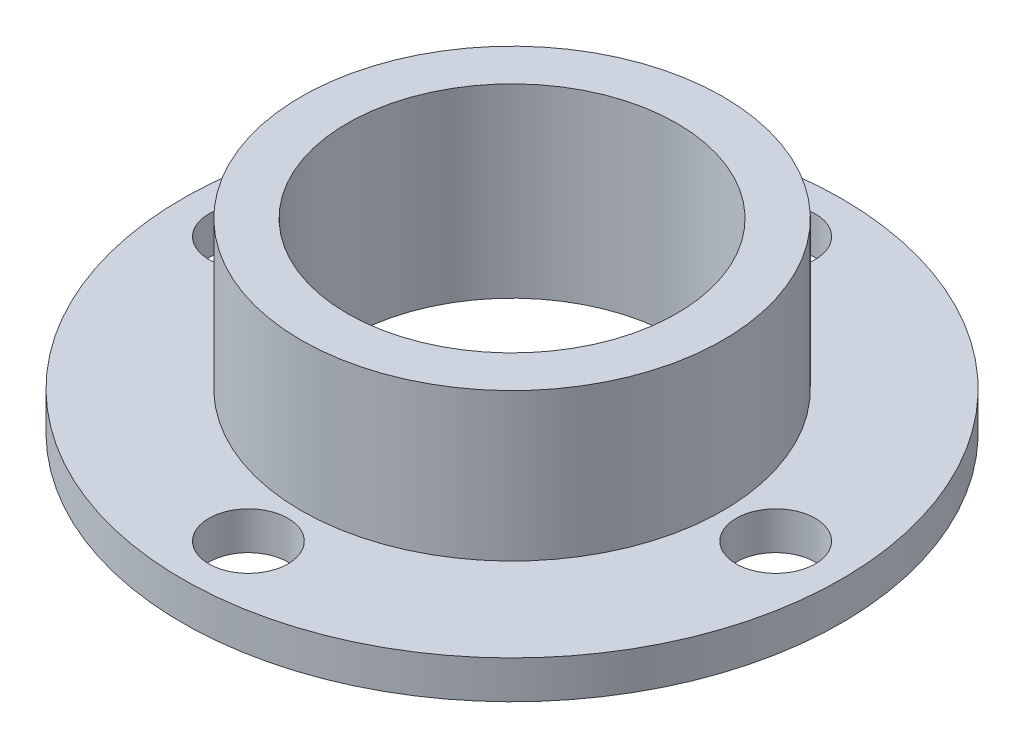
ISO-10303-21;
HEADER;
FILE_DESCRIPTION(('STEP AP214'),'2;1');
FILE_NAME('part.step','',(''),(''),'','','');
FILE_SCHEMA(('AUTOMOTIVE_DESIGN { 1 0 10303 214 1 1 1 1 }'));
ENDSEC;
DATA;
#1=APPLICATION_CONTEXT('core data for automotive mechanical design processes');
#2=APPLICATION_PROTOCOL_DEFINITION('international standard','automotive_design',2000,#1);
#3=PRODUCT_CONTEXT('',#1,'mechanical');
#4=PRODUCT('Part','Part','',(#3));
#5=PRODUCT_RELATED_PRODUCT_CATEGORY('part','',(#4));
#6=PRODUCT_DEFINITION_FORMATION('','',#4);
#7=PRODUCT_DEFINITION_CONTEXT('part definition',#1,'design');
#8=PRODUCT_DEFINITION('design','',#6,#7);
#9=PRODUCT_DEFINITION_SHAPE('','',#8);
#10=(LENGTH_UNIT() NAMED_UNIT(*) SI_UNIT(.MILLI.,.METRE.));
#11=(NAMED_UNIT(*) PLANE_ANGLE_UNIT() SI_UNIT($,.RADIAN.));
#12=(NAMED_UNIT(*) SI_UNIT($,.STERADIAN.) SOLID_ANGLE_UNIT());
#13=UNCERTAINTY_MEASURE_WITH_UNIT(LENGTH_MEASURE(1.E-05),#10,'distance_accuracy_value','');
#14=(GEOMETRIC_REPRESENTATION_CONTEXT(3) GLOBAL_UNCERTAINTY_ASSIGNED_CONTEXT((#13)) GLOBAL_UNIT_ASSIGNED_CONTEXT((#10,
#11,#12)) REPRESENTATION_CONTEXT('',''));
#15=CARTESIAN_POINT('',(0.,0.,0.));
#16=DIRECTION('',(0.,0.,1.));
#17=DIRECTION('',(1.,0.,0.));
#18=AXIS2_PLACEMENT_3D('',#15,#16,#17);
#19=CARTESIAN_POINT('',(0.,1.44,0.));
#20=DIRECTION('',(0.,1.,0.));
#21=DIRECTION('',(0.,0.,1.));
#22=AXIS2_PLACEMENT_3D('',#19,#20,#21);
#23=PLANE('',#22);
#24=CARTESIAN_POINT('',(0.,1.44,0.));
#25=DIRECTION('',(0.,1.,0.));
#26=DIRECTION('',(0.,0.,1.));
#27=AXIS2_PLACEMENT_3D('',#24,#25,#26);
#28=CIRCLE('',#27,8.);
#29=CARTESIAN_POINT('',(0.,1.44,8.));
#30=VERTEX_POINT('',#29);
#31=EDGE_CURVE('E10',#30,#30,#28,.T.);
#32=ORIENTED_EDGE('',*,*,#31,.F.);
#33=EDGE_LOOP('',(#32));
#34=FACE_BOUND('',#33,.T.);
#35=CARTESIAN_POINT('',(0.,1.44,10.));
#36=DIRECTION('',(0.,1.,0.));
#37=DIRECTION('',(0.,0.,1.));
#38=AXIS2_PLACEMENT_3D('',#35,#36,#37);
#39=CIRCLE('',#38,1.5);
#40=CARTESIAN_POINT('',(0.,1.44,8.5));
#41=VERTEX_POINT('',#40);
#42=EDGE_CURVE('E72',#41,#41,#39,.T.);
#43=ORIENTED_EDGE('',*,*,#42,.F.);
#44=EDGE_LOOP('',(#43));
#45=FACE_BOUND('',#44,.T.);
#46=CARTESIAN_POINT('',(0.,1.44,-10.));
#47=DIRECTION('',(0.,1.,0.));
#48=DIRECTION('',(0.,0.,1.));
#49=AXIS2_PLACEMENT_3D('',#46,#47,#48);
#50=CIRCLE('',#49,1.5);
#51=CARTESIAN_POINT('',(0.,1.44,-11.5));
#52=VERTEX_POINT('',#51);
#53=EDGE_CURVE('E88',#52,#52,#50,.T.);
#54=ORIENTED_EDGE('',*,*,#53,.F.);
#55=EDGE_LOOP('',(#54));
#56=FACE_BOUND('',#55,.T.);
#57=CARTESIAN_POINT('',(0.,1.44,0.));
#58=DIRECTION('',(0.,1.,0.));
#59=DIRECTION('',(0.,0.,1.));
#60=AXIS2_PLACEMENT_3D('',#57,#58,#59);
#61=CIRCLE('',#60,12.5);
#62=CARTESIAN_POINT('',(0.,1.44,-12.5));
#63=VERTEX_POINT('',#62);
#64=EDGE_CURVE('E52',#63,#63,#61,.T.);
#65=ORIENTED_EDGE('',*,*,#64,.T.);
#66=EDGE_LOOP('',(#65));
#67=FACE_BOUND('',#66,.T.);
#68=CARTESIAN_POINT('',(10.,1.44,0.));
#69=DIRECTION('',(0.,1.,0.));
#70=DIRECTION('',(0.,0.,1.));
#71=AXIS2_PLACEMENT_3D('',#68,#69,#70);
#72=CIRCLE('',#71,1.5);
#73=CARTESIAN_POINT('',(10.,1.44,-1.49999999999996));
#74=VERTEX_POINT('',#73);
#75=EDGE_CURVE('E80',#74,#74,#72,.T.);
#76=ORIENTED_EDGE('',*,*,#75,.F.);
#77=EDGE_LOOP('',(#76));
#78=FACE_BOUND('',#77,.T.);
#79=CARTESIAN_POINT('',(-10.,1.44,-1.04744440165294E-13));
#80=DIRECTION('',(0.,1.,0.));
#81=DIRECTION('',(0.,0.,1.));
#82=AXIS2_PLACEMENT_3D('',#79,#80,#81);
#83=CIRCLE('',#82,1.5);
#84=CARTESIAN_POINT('',(-10.,1.44,-1.5000000000001));
#85=VERTEX_POINT('',#84);
#86=EDGE_CURVE('E63',#85,#85,#83,.T.);
#87=ORIENTED_EDGE('',*,*,#86,.F.);
#88=EDGE_LOOP('',(#87));
#89=FACE_BOUND('',#88,.T.);
#90=ADVANCED_FACE('F43',(#34,#45,#56,#67,#78,#89),#23,.T.);
#91=CARTESIAN_POINT('',(0.,0.,0.));
#92=DIRECTION('',(0.,1.,0.));
#93=DIRECTION('',(0.,0.,1.));
#94=AXIS2_PLACEMENT_3D('',#91,#92,#93);
#95=PLANE('',#94);
#96=CARTESIAN_POINT('',(0.,0.,0.));
#97=DIRECTION('',(0.,1.,0.));
#98=DIRECTION('',(0.,0.,1.));
#99=AXIS2_PLACEMENT_3D('',#96,#97,#98);
#100=CIRCLE('',#99,12.5);
#101=CARTESIAN_POINT('',(0.,0.,-12.5));
#102=VERTEX_POINT('',#101);
#103=EDGE_CURVE('E47',#102,#102,#100,.T.);
#104=ORIENTED_EDGE('',*,*,#103,.F.);
#105=EDGE_LOOP('',(#104));
#106=FACE_BOUND('',#105,.T.);
#107=CARTESIAN_POINT('',(0.,0.,0.));
#108=DIRECTION('',(0.,1.,0.));
#109=DIRECTION('',(0.,0.,1.));
#110=AXIS2_PLACEMENT_3D('',#107,#108,#109);
#111=CIRCLE('',#110,6.25);
#112=CARTESIAN_POINT('',(0.,0.,-6.25));
#113=VERTEX_POINT('',#112);
#114=EDGE_CURVE('E91',#113,#113,#111,.T.);
#115=ORIENTED_EDGE('',*,*,#114,.T.);
#116=EDGE_LOOP('',(#115));
#117=FACE_BOUND('',#116,.T.);
#118=CARTESIAN_POINT('',(0.,0.,-10.));
#119=DIRECTION('',(0.,1.,0.));
#120=DIRECTION('',(0.,0.,1.));
#121=AXIS2_PLACEMENT_3D('',#118,#119,#120);
#122=CIRCLE('',#121,1.5);
#123=CARTESIAN_POINT('',(0.,0.,-11.5));
#124=VERTEX_POINT('',#123);
#125=EDGE_CURVE('E84',#124,#124,#122,.T.);
#126=ORIENTED_EDGE('',*,*,#125,.T.);
#127=EDGE_LOOP('',(#126));
#128=FACE_BOUND('',#127,.T.);
#129=CARTESIAN_POINT('',(10.,0.,0.));
#130=DIRECTION('',(0.,1.,0.));
#131=DIRECTION('',(0.,0.,1.));
#132=AXIS2_PLACEMENT_3D('',#129,#130,#131);
#133=CIRCLE('',#132,1.5);
#134=CARTESIAN_POINT('',(10.,0.,-1.49999999999996));
#135=VERTEX_POINT('',#134);
#136=EDGE_CURVE('E76',#135,#135,#133,.T.);
#137=ORIENTED_EDGE('',*,*,#136,.T.);
#138=EDGE_LOOP('',(#137));
#139=FACE_BOUND('',#138,.T.);
#140=CARTESIAN_POINT('',(0.,0.,10.));
#141=DIRECTION('',(0.,1.,0.));
#142=DIRECTION('',(0.,0.,1.));
#143=AXIS2_PLACEMENT_3D('',#140,#141,#142);
#144=CIRCLE('',#143,1.5);
#145=CARTESIAN_POINT('',(0.,0.,8.5));
#146=VERTEX_POINT('',#145);
#147=EDGE_CURVE('E67',#146,#146,#144,.T.);
#148=ORIENTED_EDGE('',*,*,#147,.T.);
#149=EDGE_LOOP('',(#148));
#150=FACE_BOUND('',#149,.T.);
#151=CARTESIAN_POINT('',(-10.,0.,-1.04744440165294E-13));
#152=DIRECTION('',(0.,1.,0.));
#153=DIRECTION('',(0.,0.,1.));
#154=AXIS2_PLACEMENT_3D('',#151,#152,#153);
#155=CIRCLE('',#154,1.5);
#156=CARTESIAN_POINT('',(-10.,0.,-1.5000000000001));
#157=VERTEX_POINT('',#156);
#158=EDGE_CURVE('E68',#157,#157,#155,.T.);
#159=ORIENTED_EDGE('',*,*,#158,.T.);
#160=EDGE_LOOP('',(#159));
#161=FACE_BOUND('',#160,.T.);
#162=ADVANCED_FACE('F104',(#106,#117,#128,#139,#150,#161),#95,.F.);
#163=CARTESIAN_POINT('',(0.,1.44,0.));
#164=DIRECTION('',(0.,-1.,0.));
#165=DIRECTION('',(0.,0.,-1.));
#166=AXIS2_PLACEMENT_3D('',#163,#164,#165);
#167=CYLINDRICAL_SURFACE('',#166,12.5);
#168=CARTESIAN_POINT('',(0.,1.44,-12.5));
#169=CARTESIAN_POINT('',(0.,1.425,-12.5));
#170=CARTESIAN_POINT('',(0.,1.41,-12.5));
#171=CARTESIAN_POINT('',(0.,1.38,-12.5));
#172=CARTESIAN_POINT('',(0.,1.365,-12.5));
#173=CARTESIAN_POINT('',(0.,1.335,-12.5));
#174=CARTESIAN_POINT('',(0.,1.32,-12.5));
#175=CARTESIAN_POINT('',(0.,1.29,-12.5));
#176=CARTESIAN_POINT('',(0.,1.275,-12.5));
#177=CARTESIAN_POINT('',(0.,1.245,-12.5));
#178=CARTESIAN_POINT('',(0.,1.23,-12.5));
#179=CARTESIAN_POINT('',(0.,1.2,-12.5));
#180=CARTESIAN_POINT('',(0.,1.185,-12.5));
#181=CARTESIAN_POINT('',(0.,1.155,-12.5));
#182=CARTESIAN_POINT('',(0.,1.14,-12.5));
#183=CARTESIAN_POINT('',(0.,1.11,-12.5));
#184=CARTESIAN_POINT('',(0.,1.095,-12.5));
#185=CARTESIAN_POINT('',(0.,1.065,-12.5));
#186=CARTESIAN_POINT('',(0.,1.05,-12.5));
#187=CARTESIAN_POINT('',(0.,1.02,-12.5));
#188=CARTESIAN_POINT('',(0.,1.005,-12.5));
#189=CARTESIAN_POINT('',(0.,0.975,-12.5));
#190=CARTESIAN_POINT('',(0.,0.96,-12.5));
#191=CARTESIAN_POINT('',(0.,0.93,-12.5));
#192=CARTESIAN_POINT('',(0.,0.915,-12.5));
#193=CARTESIAN_POINT('',(0.,0.885,-12.5));
#194=CARTESIAN_POINT('',(0.,0.87,-12.5));
#195=CARTESIAN_POINT('',(0.,0.84,-12.5));
#196=CARTESIAN_POINT('',(0.,0.825,-12.5));
#197=CARTESIAN_POINT('',(0.,0.795,-12.5));
#198=CARTESIAN_POINT('',(0.,0.78,-12.5));
#199=CARTESIAN_POINT('',(0.,0.75,-12.5));
#200=CARTESIAN_POINT('',(0.,0.735,-12.5));
#201=CARTESIAN_POINT('',(0.,0.705,-12.5));
#202=CARTESIAN_POINT('',(0.,0.69,-12.5));
#203=CARTESIAN_POINT('',(0.,0.66,-12.5));
#204=CARTESIAN_POINT('',(0.,0.645,-12.5));
#205=CARTESIAN_POINT('',(0.,0.615,-12.5));
#206=CARTESIAN_POINT('',(0.,0.6,-12.5));
#207=CARTESIAN_POINT('',(0.,0.57,-12.5));
#208=CARTESIAN_POINT('',(0.,0.555,-12.5));
#209=CARTESIAN_POINT('',(0.,0.525,-12.5));
#210=CARTESIAN_POINT('',(0.,0.51,-12.5));
#211=CARTESIAN_POINT('',(0.,0.48,-12.5));
#212=CARTESIAN_POINT('',(0.,0.465,-12.5));
#213=CARTESIAN_POINT('',(0.,0.435,-12.5));
#214=CARTESIAN_POINT('',(0.,0.42,-12.5));
#215=CARTESIAN_POINT('',(0.,0.39,-12.5));
#216=CARTESIAN_POINT('',(0.,0.375,-12.5));
#217=CARTESIAN_POINT('',(0.,0.345,-12.5));
#218=CARTESIAN_POINT('',(0.,0.33,-12.5));
#219=CARTESIAN_POINT('',(0.,0.3,-12.5));
#220=CARTESIAN_POINT('',(0.,0.285,-12.5));
#221=CARTESIAN_POINT('',(0.,0.255,-12.5));
#222=CARTESIAN_POINT('',(0.,0.24,-12.5));
#223=CARTESIAN_POINT('',(0.,0.21,-12.5));
#224=CARTESIAN_POINT('',(0.,0.195,-12.5));
#225=CARTESIAN_POINT('',(0.,0.165,-12.5));
#226=CARTESIAN_POINT('',(0.,0.15,-12.5));
#227=CARTESIAN_POINT('',(0.,0.12,-12.5));
#228=CARTESIAN_POINT('',(0.,0.105,-12.5));
#229=CARTESIAN_POINT('',(0.,0.0749999999999998,-12.5));
#230=CARTESIAN_POINT('',(0.,0.0599999999999997,-12.5));
#231=CARTESIAN_POINT('',(0.,0.0299999999999997,-12.5));
#232=CARTESIAN_POINT('',(0.,0.0149999999999998,-12.5));
#233=CARTESIAN_POINT('',(0.,0.,-12.5));
#234=B_SPLINE_CURVE_WITH_KNOTS('',3,(#168,#169,#170,#171,#172,#173,#174,#175,#176,#177,#178,
#179,#180,#181,#182,#183,#184,#185,#186,#187,#188,#189,#190,#191,#192,#193,#194,#195,#196,#197,
#198,#199,#200,#201,#202,#203,#204,#205,#206,#207,#208,#209,#210,#211,#212,#213,#214,#215,#216,
#217,#218,#219,#220,#221,#222,#223,#224,#225,#226,#227,#228,#229,#230,#231,#232,#233),
.UNSPECIFIED.,.F.,.F.,(4,2,2,2,2,2,2,2,2,2,2,2,2,2,2,2,2,2,2,2,2,2,2,2,2,2,2,2,2,2,2,2,4),(0.,
0.0450000000000001,0.09,0.135,0.18,0.225,0.27,0.315,0.36,0.405,0.45,0.495,0.54,0.585,0.63,0.675,
0.72,0.765,0.81,0.855,0.9,0.945,0.99,1.035,1.08,1.125,1.17,1.215,1.26,1.305,1.35,1.395,1.44),.UNSPECIFIED.);
#235=EDGE_CURVE('BSEAM45',#63,#102,#234,.T.);
#236=ORIENTED_EDGE('',*,*,#64,.F.);
#237=ORIENTED_EDGE('',*,*,#103,.T.);
#238=ORIENTED_EDGE('',*,*,#235,.T.);
#239=ORIENTED_EDGE('',*,*,#235,.F.);
#240=EDGE_LOOP('',(#236,#238,#237,#239));
#241=FACE_BOUND('',#240,.T.);
#242=ADVANCED_FACE('F45',(#241),#167,.T.);
#243=CARTESIAN_POINT('',(0.,1.44,0.));
#244=DIRECTION('',(0.,-1.,0.));
#245=DIRECTION('',(0.,0.,-1.));
#246=AXIS2_PLACEMENT_3D('',#243,#244,#245);
#247=CYLINDRICAL_SURFACE('',#246,6.25);
#248=CARTESIAN_POINT('',(0.,7.04,0.));
#249=DIRECTION('',(0.,1.,0.));
#250=DIRECTION('',(0.,0.,1.));
#251=AXIS2_PLACEMENT_3D('',#248,#249,#250);
#252=CIRCLE('',#251,6.25);
#253=CARTESIAN_POINT('',(0.,7.04,-6.25));
#254=VERTEX_POINT('',#253);
#255=EDGE_CURVE('E252',#254,#254,#252,.T.);
#256=CARTESIAN_POINT('',(0.,0.,-6.25));
#257=CARTESIAN_POINT('',(0.,0.0733333333333332,-6.25));
#258=CARTESIAN_POINT('',(0.,0.146666666666666,-6.25));
#259=CARTESIAN_POINT('',(0.,0.293333333333333,-6.25));
#260=CARTESIAN_POINT('',(0.,0.366666666666666,-6.25));
#261=CARTESIAN_POINT('',(0.,0.513333333333333,-6.25));
#262=CARTESIAN_POINT('',(0.,0.586666666666666,-6.25));
#263=CARTESIAN_POINT('',(0.,0.733333333333333,-6.25));
#264=CARTESIAN_POINT('',(0.,0.806666666666666,-6.25));
#265=CARTESIAN_POINT('',(0.,0.953333333333333,-6.25));
#266=CARTESIAN_POINT('',(0.,1.02666666666667,-6.25));
#267=CARTESIAN_POINT('',(0.,1.17333333333333,-6.25));
#268=CARTESIAN_POINT('',(0.,1.24666666666667,-6.25));
#269=CARTESIAN_POINT('',(0.,1.39333333333333,-6.25));
#270=CARTESIAN_POINT('',(0.,1.46666666666667,-6.25));
#271=CARTESIAN_POINT('',(0.,1.61333333333333,-6.25));
#272=CARTESIAN_POINT('',(0.,1.68666666666667,-6.25));
#273=CARTESIAN_POINT('',(0.,1.83333333333333,-6.25));
#274=CARTESIAN_POINT('',(0.,1.90666666666667,-6.25));
#275=CARTESIAN_POINT('',(0.,2.05333333333333,-6.25));
#276=CARTESIAN_POINT('',(0.,2.12666666666667,-6.25));
#277=CARTESIAN_POINT('',(0.,2.27333333333333,-6.25));
#278=CARTESIAN_POINT('',(0.,2.34666666666667,-6.25));
#279=CARTESIAN_POINT('',(0.,2.49333333333333,-6.25));
#280=CARTESIAN_POINT('',(0.,2.56666666666667,-6.25));
#281=CARTESIAN_POINT('',(0.,2.71333333333333,-6.25));
#282=CARTESIAN_POINT('',(0.,2.78666666666667,-6.25));
#283=CARTESIAN_POINT('',(0.,2.93333333333333,-6.25));
#284=CARTESIAN_POINT('',(0.,3.00666666666667,-6.25));
#285=CARTESIAN_POINT('',(0.,3.15333333333333,-6.25));
#286=CARTESIAN_POINT('',(0.,3.22666666666667,-6.25));
#287=CARTESIAN_POINT('',(0.,3.37333333333333,-6.25));
#288=CARTESIAN_POINT('',(0.,3.44666666666667,-6.25));
#289=CARTESIAN_POINT('',(0.,3.59333333333333,-6.25));
#290=CARTESIAN_POINT('',(0.,3.66666666666667,-6.25));
#291=CARTESIAN_POINT('',(0.,3.81333333333333,-6.25));
#292=CARTESIAN_POINT('',(0.,3.88666666666667,-6.25));
#293=CARTESIAN_POINT('',(0.,4.03333333333333,-6.25));
#294=CARTESIAN_POINT('',(0.,4.10666666666667,-6.25));
#295=CARTESIAN_POINT('',(0.,4.25333333333333,-6.25));
#296=CARTESIAN_POINT('',(0.,4.32666666666667,-6.25));
#297=CARTESIAN_POINT('',(0.,4.47333333333333,-6.25));
#298=CARTESIAN_POINT('',(0.,4.54666666666667,-6.25));
#299=CARTESIAN_POINT('',(0.,4.69333333333333,-6.25));
#300=CARTESIAN_POINT('',(0.,4.76666666666667,-6.25));
#301=CARTESIAN_POINT('',(0.,4.91333333333333,-6.25));
#302=CARTESIAN_POINT('',(0.,4.98666666666667,-6.25));
#303=CARTESIAN_POINT('',(0.,5.13333333333333,-6.25));
#304=CARTESIAN_POINT('',(0.,5.20666666666667,-6.25));
#305=CARTESIAN_POINT('',(0.,5.35333333333333,-6.25));
#306=CARTESIAN_POINT('',(0.,5.42666666666666,-6.25));
#307=CARTESIAN_POINT('',(0.,5.57333333333333,-6.25));
#308=CARTESIAN_POINT('',(0.,5.64666666666666,-6.25));
#309=CARTESIAN_POINT('',(0.,5.79333333333333,-6.25));
#310=CARTESIAN_POINT('',(0.,5.86666666666666,-6.25));
#311=CARTESIAN_POINT('',(0.,6.01333333333333,-6.25));
#312=CARTESIAN_POINT('',(0.,6.08666666666667,-6.25));
#313=CARTESIAN_POINT('',(0.,6.23333333333333,-6.25));
#314=CARTESIAN_POINT('',(0.,6.30666666666666,-6.25));
#315=CARTESIAN_POINT('',(0.,6.45333333333333,-6.25));
#316=CARTESIAN_POINT('',(0.,6.52666666666666,-6.25));
#317=CARTESIAN_POINT('',(0.,6.67333333333333,-6.25));
#318=CARTESIAN_POINT('',(0.,6.74666666666666,-6.25));
#319=CARTESIAN_POINT('',(0.,6.89333333333333,-6.25));
#320=CARTESIAN_POINT('',(0.,6.96666666666666,-6.25));
#321=CARTESIAN_POINT('',(0.,7.04,-6.25));
#322=B_SPLINE_CURVE_WITH_KNOTS('',3,(#256,#257,#258,#259,#260,#261,#262,#263,#264,#265,#266,
#267,#268,#269,#270,#271,#272,#273,#274,#275,#276,#277,#278,#279,#280,#281,#282,#283,#284,#285,
#286,#287,#288,#289,#290,#291,#292,#293,#294,#295,#296,#297,#298,#299,#300,#301,#302,#303,#304,
#305,#306,#307,#308,#309,#310,#311,#312,#313,#314,#315,#316,#317,#318,#319,#320,#321),
.UNSPECIFIED.,.F.,.F.,(4,2,2,2,2,2,2,2,2,2,2,2,2,2,2,2,2,2,2,2,2,2,2,2,2,2,2,2,2,2,2,2,4),(0.,
0.22,0.44,0.66,0.88,1.1,1.32,1.54,1.76,1.98,2.2,2.42,2.64,2.86,3.08,3.3,3.52,3.74,3.96,4.18,4.4,
4.62,4.84,5.06,5.28,5.5,5.72,5.94,6.16,6.38,6.6,6.82,7.04),.UNSPECIFIED.);
#323=EDGE_CURVE('BSEAM139',#113,#254,#322,.T.);
#324=ORIENTED_EDGE('',*,*,#114,.F.);
#325=ORIENTED_EDGE('',*,*,#255,.T.);
#326=ORIENTED_EDGE('',*,*,#323,.T.);
#327=ORIENTED_EDGE('',*,*,#323,.F.);
#328=EDGE_LOOP('',(#324,#326,#325,#327));
#329=FACE_BOUND('',#328,.T.);
#330=ADVANCED_FACE('F139',(#329),#247,.F.);
#331=CARTESIAN_POINT('',(0.,1.44,-10.));
#332=DIRECTION('',(0.,-1.,0.));
#333=DIRECTION('',(0.,0.,-1.));
#334=AXIS2_PLACEMENT_3D('',#331,#332,#333);
#335=CYLINDRICAL_SURFACE('',#334,1.5);
#336=CARTESIAN_POINT('',(0.,1.44,-11.5));
#337=CARTESIAN_POINT('',(0.,1.425,-11.5));
#338=CARTESIAN_POINT('',(0.,1.41,-11.5));
#339=CARTESIAN_POINT('',(0.,1.38,-11.5));
#340=CARTESIAN_POINT('',(0.,1.365,-11.5));
#341=CARTESIAN_POINT('',(0.,1.335,-11.5));
#342=CARTESIAN_POINT('',(0.,1.32,-11.5));
#343=CARTESIAN_POINT('',(0.,1.29,-11.5));
#344=CARTESIAN_POINT('',(0.,1.275,-11.5));
#345=CARTESIAN_POINT('',(0.,1.245,-11.5));
#346=CARTESIAN_POINT('',(0.,1.23,-11.5));
#347=CARTESIAN_POINT('',(0.,1.2,-11.5));
#348=CARTESIAN_POINT('',(0.,1.185,-11.5));
#349=CARTESIAN_POINT('',(0.,1.155,-11.5));
#350=CARTESIAN_POINT('',(0.,1.14,-11.5));
#351=CARTESIAN_POINT('',(0.,1.11,-11.5));
#352=CARTESIAN_POINT('',(0.,1.095,-11.5));
#353=CARTESIAN_POINT('',(0.,1.065,-11.5));
#354=CARTESIAN_POINT('',(0.,1.05,-11.5));
#355=CARTESIAN_POINT('',(0.,1.02,-11.5));
#356=CARTESIAN_POINT('',(0.,1.005,-11.5));
#357=CARTESIAN_POINT('',(0.,0.975,-11.5));
#358=CARTESIAN_POINT('',(0.,0.96,-11.5));
#359=CARTESIAN_POINT('',(0.,0.93,-11.5));
#360=CARTESIAN_POINT('',(0.,0.915,-11.5));
#361=CARTESIAN_POINT('',(0.,0.885,-11.5));
#362=CARTESIAN_POINT('',(0.,0.87,-11.5));
#363=CARTESIAN_POINT('',(0.,0.84,-11.5));
#364=CARTESIAN_POINT('',(0.,0.825,-11.5));
#365=CARTESIAN_POINT('',(0.,0.795,-11.5));
#366=CARTESIAN_POINT('',(0.,0.78,-11.5));
#367=CARTESIAN_POINT('',(0.,0.75,-11.5));
#368=CARTESIAN_POINT('',(0.,0.735,-11.5));
#369=CARTESIAN_POINT('',(0.,0.705,-11.5));
#370=CARTESIAN_POINT('',(0.,0.69,-11.5));
#371=CARTESIAN_POINT('',(0.,0.66,-11.5));
#372=CARTESIAN_POINT('',(0.,0.645,-11.5));
#373=CARTESIAN_POINT('',(0.,0.615,-11.5));
#374=CARTESIAN_POINT('',(0.,0.6,-11.5));
#375=CARTESIAN_POINT('',(0.,0.57,-11.5));
#376=CARTESIAN_POINT('',(0.,0.555,-11.5));
#377=CARTESIAN_POINT('',(0.,0.525,-11.5));
#378=CARTESIAN_POINT('',(0.,0.51,-11.5));
#379=CARTESIAN_POINT('',(0.,0.48,-11.5));
#380=CARTESIAN_POINT('',(0.,0.465,-11.5));
#381=CARTESIAN_POINT('',(0.,0.435,-11.5));
#382=CARTESIAN_POINT('',(0.,0.42,-11.5));
#383=CARTESIAN_POINT('',(0.,0.39,-11.5));
#384=CARTESIAN_POINT('',(0.,0.375,-11.5));
#385=CARTESIAN_POINT('',(0.,0.345,-11.5));
#386=CARTESIAN_POINT('',(0.,0.33,-11.5));
#387=CARTESIAN_POINT('',(0.,0.3,-11.5));
#388=CARTESIAN_POINT('',(0.,0.285,-11.5));
#389=CARTESIAN_POINT('',(0.,0.255,-11.5));
#390=CARTESIAN_POINT('',(0.,0.24,-11.5));
#391=CARTESIAN_POINT('',(0.,0.21,-11.5));
#392=CARTESIAN_POINT('',(0.,0.195,-11.5));
#393=CARTESIAN_POINT('',(0.,0.165,-11.5));
#394=CARTESIAN_POINT('',(0.,0.15,-11.5));
#395=CARTESIAN_POINT('',(0.,0.12,-11.5));
#396=CARTESIAN_POINT('',(0.,0.105,-11.5));
#397=CARTESIAN_POINT('',(0.,0.0749999999999998,-11.5));
#398=CARTESIAN_POINT('',(0.,0.0599999999999997,-11.5));
#399=CARTESIAN_POINT('',(0.,0.0299999999999997,-11.5));
#400=CARTESIAN_POINT('',(0.,0.0149999999999998,-11.5));
#401=CARTESIAN_POINT('',(0.,0.,-11.5));
#402=B_SPLINE_CURVE_WITH_KNOTS('',3,(#336,#337,#338,#339,#340,#341,#342,#343,#344,#345,#346,
#347,#348,#349,#350,#351,#352,#353,#354,#355,#356,#357,#358,#359,#360,#361,#362,#363,#364,#365,
#366,#367,#368,#369,#370,#371,#372,#373,#374,#375,#376,#377,#378,#379,#380,#381,#382,#383,#384,
#385,#386,#387,#388,#389,#390,#391,#392,#393,#394,#395,#396,#397,#398,#399,#400,#401),
.UNSPECIFIED.,.F.,.F.,(4,2,2,2,2,2,2,2,2,2,2,2,2,2,2,2,2,2,2,2,2,2,2,2,2,2,2,2,2,2,2,2,4),(0.,
0.0450000000000001,0.09,0.135,0.18,0.225,0.27,0.315,0.36,0.405,0.45,0.495,0.54,0.585,0.63,0.675,
0.72,0.765,0.81,0.855,0.9,0.945,0.99,1.035,1.08,1.125,1.17,1.215,1.26,1.305,1.35,1.395,1.44),.UNSPECIFIED.);
#403=EDGE_CURVE('BSEAM142',#52,#124,#402,.T.);
#404=ORIENTED_EDGE('',*,*,#53,.T.);
#405=ORIENTED_EDGE('',*,*,#125,.F.);
#406=ORIENTED_EDGE('',*,*,#403,.T.);
#407=ORIENTED_EDGE('',*,*,#403,.F.);
#408=EDGE_LOOP('',(#404,#406,#405,#407));
#409=FACE_BOUND('',#408,.T.);
#410=ADVANCED_FACE('F142',(#409),#335,.F.);
#411=CARTESIAN_POINT('',(10.,1.44,0.));
#412=DIRECTION('',(0.,-1.,0.));
#413=DIRECTION('',(0.,0.,-1.));
#414=AXIS2_PLACEMENT_3D('',#411,#412,#413);
#415=CYLINDRICAL_SURFACE('',#414,1.5);
#416=CARTESIAN_POINT('',(10.,1.44,-1.49999999999996));
#417=CARTESIAN_POINT('',(10.,1.425,-1.49999999999996));
#418=CARTESIAN_POINT('',(10.,1.41,-1.49999999999996));
#419=CARTESIAN_POINT('',(10.,1.38,-1.49999999999996));
#420=CARTESIAN_POINT('',(10.,1.365,-1.49999999999996));
#421=CARTESIAN_POINT('',(10.,1.335,-1.49999999999996));
#422=CARTESIAN_POINT('',(10.,1.32,-1.49999999999996));
#423=CARTESIAN_POINT('',(10.,1.29,-1.49999999999996));
#424=CARTESIAN_POINT('',(10.,1.275,-1.49999999999996));
#425=CARTESIAN_POINT('',(10.,1.245,-1.49999999999996));
#426=CARTESIAN_POINT('',(10.,1.23,-1.49999999999996));
#427=CARTESIAN_POINT('',(10.,1.2,-1.49999999999996));
#428=CARTESIAN_POINT('',(10.,1.185,-1.49999999999996));
#429=CARTESIAN_POINT('',(10.,1.155,-1.49999999999996));
#430=CARTESIAN_POINT('',(10.,1.14,-1.49999999999996));
#431=CARTESIAN_POINT('',(10.,1.11,-1.49999999999996));
#432=CARTESIAN_POINT('',(10.,1.095,-1.49999999999996));
#433=CARTESIAN_POINT('',(10.,1.065,-1.49999999999996));
#434=CARTESIAN_POINT('',(10.,1.05,-1.49999999999996));
#435=CARTESIAN_POINT('',(10.,1.02,-1.49999999999996));
#436=CARTESIAN_POINT('',(10.,1.005,-1.49999999999996));
#437=CARTESIAN_POINT('',(10.,0.975,-1.49999999999996));
#438=CARTESIAN_POINT('',(10.,0.96,-1.49999999999996));
#439=CARTESIAN_POINT('',(10.,0.93,-1.49999999999996));
#440=CARTESIAN_POINT('',(10.,0.915,-1.49999999999996));
#441=CARTESIAN_POINT('',(10.,0.885,-1.49999999999996));
#442=CARTESIAN_POINT('',(10.,0.87,-1.49999999999996));
#443=CARTESIAN_POINT('',(10.,0.84,-1.49999999999996));
#444=CARTESIAN_POINT('',(10.,0.825,-1.49999999999996));
#445=CARTESIAN_POINT('',(10.,0.795,-1.49999999999996));
#446=CARTESIAN_POINT('',(10.,0.78,-1.49999999999996));
#447=CARTESIAN_POINT('',(10.,0.75,-1.49999999999996));
#448=CARTESIAN_POINT('',(10.,0.735,-1.49999999999996));
#449=CARTESIAN_POINT('',(10.,0.705,-1.49999999999996));
#450=CARTESIAN_POINT('',(10.,0.69,-1.49999999999996));
#451=CARTESIAN_POINT('',(10.,0.66,-1.49999999999996));
#452=CARTESIAN_POINT('',(10.,0.645,-1.49999999999996));
#453=CARTESIAN_POINT('',(10.,0.615,-1.49999999999996));
#454=CARTESIAN_POINT('',(10.,0.6,-1.49999999999996));
#455=CARTESIAN_POINT('',(10.,0.57,-1.49999999999996));
#456=CARTESIAN_POINT('',(10.,0.555,-1.49999999999996));
#457=CARTESIAN_POINT('',(10.,0.525,-1.49999999999996));
#458=CARTESIAN_POINT('',(10.,0.51,-1.49999999999996));
#459=CARTESIAN_POINT('',(10.,0.48,-1.49999999999996));
#460=CARTESIAN_POINT('',(10.,0.465,-1.49999999999996));
#461=CARTESIAN_POINT('',(10.,0.435,-1.49999999999996));
#462=CARTESIAN_POINT('',(10.,0.42,-1.49999999999996));
#463=CARTESIAN_POINT('',(10.,0.39,-1.49999999999996));
#464=CARTESIAN_POINT('',(10.,0.375,-1.49999999999996));
#465=CARTESIAN_POINT('',(10.,0.345,-1.49999999999996));
#466=CARTESIAN_POINT('',(10.,0.33,-1.49999999999996));
#467=CARTESIAN_POINT('',(10.,0.3,-1.49999999999996));
#468=CARTESIAN_POINT('',(10.,0.285,-1.49999999999996));
#469=CARTESIAN_POINT('',(10.,0.255,-1.49999999999996));
#470=CARTESIAN_POINT('',(10.,0.24,-1.49999999999996));
#471=CARTESIAN_POINT('',(10.,0.21,-1.49999999999996));
#472=CARTESIAN_POINT('',(10.,0.195,-1.49999999999996));
#473=CARTESIAN_POINT('',(10.,0.165,-1.49999999999996));
#474=CARTESIAN_POINT('',(10.,0.15,-1.49999999999996));
#475=CARTESIAN_POINT('',(10.,0.12,-1.49999999999996));
#476=CARTESIAN_POINT('',(10.,0.105,-1.49999999999996));
#477=CARTESIAN_POINT('',(10.,0.0749999999999998,-1.49999999999996));
#478=CARTESIAN_POINT('',(10.,0.0599999999999997,-1.49999999999996));
#479=CARTESIAN_POINT('',(10.,0.0299999999999997,-1.49999999999996));
#480=CARTESIAN_POINT('',(10.,0.0149999999999998,-1.49999999999996));
#481=CARTESIAN_POINT('',(10.,0.,-1.49999999999996));
#482=B_SPLINE_CURVE_WITH_KNOTS('',3,(#416,#417,#418,#419,#420,#421,#422,#423,#424,#425,#426,
#427,#428,#429,#430,#431,#432,#433,#434,#435,#436,#437,#438,#439,#440,#441,#442,#443,#444,#445,
#446,#447,#448,#449,#450,#451,#452,#453,#454,#455,#456,#457,#458,#459,#460,#461,#462,#463,#464,
#465,#466,#467,#468,#469,#470,#471,#472,#473,#474,#475,#476,#477,#478,#479,#480,#481),
.UNSPECIFIED.,.F.,.F.,(4,2,2,2,2,2,2,2,2,2,2,2,2,2,2,2,2,2,2,2,2,2,2,2,2,2,2,2,2,2,2,2,4),(0.,
0.0450000000000001,0.09,0.135,0.18,0.225,0.27,0.315,0.36,0.405,0.45,0.495,0.54,0.585,0.63,0.675,
0.72,0.765,0.81,0.855,0.9,0.945,0.99,1.035,1.08,1.125,1.17,1.215,1.26,1.305,1.35,1.395,1.44),.UNSPECIFIED.);
#483=EDGE_CURVE('BSEAM128',#74,#135,#482,.T.);
#484=ORIENTED_EDGE('',*,*,#75,.T.);
#485=ORIENTED_EDGE('',*,*,#136,.F.);
#486=ORIENTED_EDGE('',*,*,#483,.T.);
#487=ORIENTED_EDGE('',*,*,#483,.F.);
#488=EDGE_LOOP('',(#484,#486,#485,#487));
#489=FACE_BOUND('',#488,.T.);
#490=ADVANCED_FACE('F128',(#489),#415,.F.);
#491=CARTESIAN_POINT('',(0.,1.44,10.));
#492=DIRECTION('',(0.,-1.,0.));
#493=DIRECTION('',(0.,0.,-1.));
#494=AXIS2_PLACEMENT_3D('',#491,#492,#493);
#495=CYLINDRICAL_SURFACE('',#494,1.5);
#496=CARTESIAN_POINT('',(0.,1.44,8.5));
#497=CARTESIAN_POINT('',(0.,1.425,8.5));
#498=CARTESIAN_POINT('',(0.,1.41,8.5));
#499=CARTESIAN_POINT('',(0.,1.38,8.5));
#500=CARTESIAN_POINT('',(0.,1.365,8.5));
#501=CARTESIAN_POINT('',(0.,1.335,8.5));
#502=CARTESIAN_POINT('',(0.,1.32,8.5));
#503=CARTESIAN_POINT('',(0.,1.29,8.5));
#504=CARTESIAN_POINT('',(0.,1.275,8.5));
#505=CARTESIAN_POINT('',(0.,1.245,8.5));
#506=CARTESIAN_POINT('',(0.,1.23,8.5));
#507=CARTESIAN_POINT('',(0.,1.2,8.5));
#508=CARTESIAN_POINT('',(0.,1.185,8.5));
#509=CARTESIAN_POINT('',(0.,1.155,8.5));
#510=CARTESIAN_POINT('',(0.,1.14,8.5));
#511=CARTESIAN_POINT('',(0.,1.11,8.5));
#512=CARTESIAN_POINT('',(0.,1.095,8.5));
#513=CARTESIAN_POINT('',(0.,1.065,8.5));
#514=CARTESIAN_POINT('',(0.,1.05,8.5));
#515=CARTESIAN_POINT('',(0.,1.02,8.5));
#516=CARTESIAN_POINT('',(0.,1.005,8.5));
#517=CARTESIAN_POINT('',(0.,0.975,8.5));
#518=CARTESIAN_POINT('',(0.,0.96,8.5));
#519=CARTESIAN_POINT('',(0.,0.93,8.5));
#520=CARTESIAN_POINT('',(0.,0.915,8.5));
#521=CARTESIAN_POINT('',(0.,0.885,8.5));
#522=CARTESIAN_POINT('',(0.,0.87,8.5));
#523=CARTESIAN_POINT('',(0.,0.84,8.5));
#524=CARTESIAN_POINT('',(0.,0.825,8.5));
#525=CARTESIAN_POINT('',(0.,0.795,8.5));
#526=CARTESIAN_POINT('',(0.,0.78,8.5));
#527=CARTESIAN_POINT('',(0.,0.75,8.5));
#528=CARTESIAN_POINT('',(0.,0.735,8.5));
#529=CARTESIAN_POINT('',(0.,0.705,8.5));
#530=CARTESIAN_POINT('',(0.,0.69,8.5));
#531=CARTESIAN_POINT('',(0.,0.66,8.5));
#532=CARTESIAN_POINT('',(0.,0.645,8.5));
#533=CARTESIAN_POINT('',(0.,0.615,8.5));
#534=CARTESIAN_POINT('',(0.,0.6,8.5));
#535=CARTESIAN_POINT('',(0.,0.57,8.5));
#536=CARTESIAN_POINT('',(0.,0.555,8.5));
#537=CARTESIAN_POINT('',(0.,0.525,8.5));
#538=CARTESIAN_POINT('',(0.,0.51,8.5));
#539=CARTESIAN_POINT('',(0.,0.48,8.5));
#540=CARTESIAN_POINT('',(0.,0.465,8.5));
#541=CARTESIAN_POINT('',(0.,0.435,8.5));
#542=CARTESIAN_POINT('',(0.,0.42,8.5));
#543=CARTESIAN_POINT('',(0.,0.39,8.5));
#544=CARTESIAN_POINT('',(0.,0.375,8.5));
#545=CARTESIAN_POINT('',(0.,0.345,8.5));
#546=CARTESIAN_POINT('',(0.,0.33,8.5));
#547=CARTESIAN_POINT('',(0.,0.3,8.5));
#548=CARTESIAN_POINT('',(0.,0.285,8.5));
#549=CARTESIAN_POINT('',(0.,0.255,8.5));
#550=CARTESIAN_POINT('',(0.,0.24,8.5));
#551=CARTESIAN_POINT('',(0.,0.21,8.5));
#552=CARTESIAN_POINT('',(0.,0.195,8.5));
#553=CARTESIAN_POINT('',(0.,0.165,8.5));
#554=CARTESIAN_POINT('',(0.,0.15,8.5));
#555=CARTESIAN_POINT('',(0.,0.12,8.5));
#556=CARTESIAN_POINT('',(0.,0.105,8.5));
#557=CARTESIAN_POINT('',(0.,0.0749999999999998,8.5));
#558=CARTESIAN_POINT('',(0.,0.0599999999999997,8.5));
#559=CARTESIAN_POINT('',(0.,0.0299999999999997,8.5));
#560=CARTESIAN_POINT('',(0.,0.0149999999999998,8.5));
#561=CARTESIAN_POINT('',(0.,0.,8.5));
#562=B_SPLINE_CURVE_WITH_KNOTS('',3,(#496,#497,#498,#499,#500,#501,#502,#503,#504,#505,#506,
#507,#508,#509,#510,#511,#512,#513,#514,#515,#516,#517,#518,#519,#520,#521,#522,#523,#524,#525,
#526,#527,#528,#529,#530,#531,#532,#533,#534,#535,#536,#537,#538,#539,#540,#541,#542,#543,#544,
#545,#546,#547,#548,#549,#550,#551,#552,#553,#554,#555,#556,#557,#558,#559,#560,#561),
.UNSPECIFIED.,.F.,.F.,(4,2,2,2,2,2,2,2,2,2,2,2,2,2,2,2,2,2,2,2,2,2,2,2,2,2,2,2,2,2,2,2,4),(0.,
0.0450000000000001,0.09,0.135,0.18,0.225,0.27,0.315,0.36,0.405,0.45,0.495,0.54,0.585,0.63,0.675,
0.72,0.765,0.81,0.855,0.9,0.945,0.99,1.035,1.08,1.125,1.17,1.215,1.26,1.305,1.35,1.395,1.44),.UNSPECIFIED.);
#563=EDGE_CURVE('BSEAM118',#41,#146,#562,.T.);
#564=ORIENTED_EDGE('',*,*,#42,.T.);
#565=ORIENTED_EDGE('',*,*,#147,.F.);
#566=ORIENTED_EDGE('',*,*,#563,.T.);
#567=ORIENTED_EDGE('',*,*,#563,.F.);
#568=EDGE_LOOP('',(#564,#566,#565,#567));
#569=FACE_BOUND('',#568,.T.);
#570=ADVANCED_FACE('F118',(#569),#495,.F.);
#571=CARTESIAN_POINT('',(-10.,1.44,-1.04744440165294E-13));
#572=DIRECTION('',(0.,-1.,0.));
#573=DIRECTION('',(0.,0.,-1.));
#574=AXIS2_PLACEMENT_3D('',#571,#572,#573);
#575=CYLINDRICAL_SURFACE('',#574,1.5);
#576=CARTESIAN_POINT('',(-10.,1.44,-1.5000000000001));
#577=CARTESIAN_POINT('',(-10.,1.425,-1.5000000000001));
#578=CARTESIAN_POINT('',(-10.,1.41,-1.5000000000001));
#579=CARTESIAN_POINT('',(-10.,1.38,-1.5000000000001));
#580=CARTESIAN_POINT('',(-10.,1.365,-1.5000000000001));
#581=CARTESIAN_POINT('',(-10.,1.335,-1.5000000000001));
#582=CARTESIAN_POINT('',(-10.,1.32,-1.5000000000001));
#583=CARTESIAN_POINT('',(-10.,1.29,-1.5000000000001));
#584=CARTESIAN_POINT('',(-10.,1.275,-1.5000000000001));
#585=CARTESIAN_POINT('',(-10.,1.245,-1.5000000000001));
#586=CARTESIAN_POINT('',(-10.,1.23,-1.5000000000001));
#587=CARTESIAN_POINT('',(-10.,1.2,-1.5000000000001));
#588=CARTESIAN_POINT('',(-10.,1.185,-1.5000000000001));
#589=CARTESIAN_POINT('',(-10.,1.155,-1.5000000000001));
#590=CARTESIAN_POINT('',(-10.,1.14,-1.5000000000001));
#591=CARTESIAN_POINT('',(-10.,1.11,-1.5000000000001));
#592=CARTESIAN_POINT('',(-10.,1.095,-1.5000000000001));
#593=CARTESIAN_POINT('',(-10.,1.065,-1.5000000000001));
#594=CARTESIAN_POINT('',(-10.,1.05,-1.5000000000001));
#595=CARTESIAN_POINT('',(-10.,1.02,-1.5000000000001));
#596=CARTESIAN_POINT('',(-10.,1.005,-1.5000000000001));
#597=CARTESIAN_POINT('',(-10.,0.975,-1.5000000000001));
#598=CARTESIAN_POINT('',(-10.,0.96,-1.5000000000001));
#599=CARTESIAN_POINT('',(-10.,0.93,-1.5000000000001));
#600=CARTESIAN_POINT('',(-10.,0.915,-1.5000000000001));
#601=CARTESIAN_POINT('',(-10.,0.885,-1.5000000000001));
#602=CARTESIAN_POINT('',(-10.,0.87,-1.5000000000001));
#603=CARTESIAN_POINT('',(-10.,0.84,-1.5000000000001));
#604=CARTESIAN_POINT('',(-10.,0.825,-1.5000000000001));
#605=CARTESIAN_POINT('',(-10.,0.795,-1.5000000000001));
#606=CARTESIAN_POINT('',(-10.,0.78,-1.5000000000001));
#607=CARTESIAN_POINT('',(-10.,0.75,-1.5000000000001));
#608=CARTESIAN_POINT('',(-10.,0.735,-1.5000000000001));
#609=CARTESIAN_POINT('',(-10.,0.705,-1.5000000000001));
#610=CARTESIAN_POINT('',(-10.,0.69,-1.5000000000001));
#611=CARTESIAN_POINT('',(-10.,0.66,-1.5000000000001));
#612=CARTESIAN_POINT('',(-10.,0.645,-1.5000000000001));
#613=CARTESIAN_POINT('',(-10.,0.615,-1.5000000000001));
#614=CARTESIAN_POINT('',(-10.,0.6,-1.5000000000001));
#615=CARTESIAN_POINT('',(-10.,0.57,-1.5000000000001));
#616=CARTESIAN_POINT('',(-10.,0.555,-1.5000000000001));
#617=CARTESIAN_POINT('',(-10.,0.525,-1.5000000000001));
#618=CARTESIAN_POINT('',(-10.,0.51,-1.5000000000001));
#619=CARTESIAN_POINT('',(-10.,0.48,-1.5000000000001));
#620=CARTESIAN_POINT('',(-10.,0.465,-1.5000000000001));
#621=CARTESIAN_POINT('',(-10.,0.435,-1.5000000000001));
#622=CARTESIAN_POINT('',(-10.,0.42,-1.5000000000001));
#623=CARTESIAN_POINT('',(-10.,0.39,-1.5000000000001));
#624=CARTESIAN_POINT('',(-10.,0.375,-1.5000000000001));
#625=CARTESIAN_POINT('',(-10.,0.345,-1.5000000000001));
#626=CARTESIAN_POINT('',(-10.,0.33,-1.5000000000001));
#627=CARTESIAN_POINT('',(-10.,0.3,-1.5000000000001));
#628=CARTESIAN_POINT('',(-10.,0.285,-1.5000000000001));
#629=CARTESIAN_POINT('',(-10.,0.255,-1.5000000000001));
#630=CARTESIAN_POINT('',(-10.,0.24,-1.5000000000001));
#631=CARTESIAN_POINT('',(-10.,0.21,-1.5000000000001));
#632=CARTESIAN_POINT('',(-10.,0.195,-1.5000000000001));
#633=CARTESIAN_POINT('',(-10.,0.165,-1.5000000000001));
#634=CARTESIAN_POINT('',(-10.,0.15,-1.5000000000001));
#635=CARTESIAN_POINT('',(-10.,0.12,-1.5000000000001));
#636=CARTESIAN_POINT('',(-10.,0.105,-1.5000000000001));
#637=CARTESIAN_POINT('',(-10.,0.0749999999999998,-1.5000000000001));
#638=CARTESIAN_POINT('',(-10.,0.0599999999999997,-1.5000000000001));
#639=CARTESIAN_POINT('',(-10.,0.0299999999999997,-1.5000000000001));
#640=CARTESIAN_POINT('',(-10.,0.0149999999999998,-1.5000000000001));
#641=CARTESIAN_POINT('',(-10.,0.,-1.5000000000001));
#642=B_SPLINE_CURVE_WITH_KNOTS('',3,(#576,#577,#578,#579,#580,#581,#582,#583,#584,#585,#586,
#587,#588,#589,#590,#591,#592,#593,#594,#595,#596,#597,#598,#599,#600,#601,#602,#603,#604,#605,
#606,#607,#608,#609,#610,#611,#612,#613,#614,#615,#616,#617,#618,#619,#620,#621,#622,#623,#624,
#625,#626,#627,#628,#629,#630,#631,#632,#633,#634,#635,#636,#637,#638,#639,#640,#641),
.UNSPECIFIED.,.F.,.F.,(4,2,2,2,2,2,2,2,2,2,2,2,2,2,2,2,2,2,2,2,2,2,2,2,2,2,2,2,2,2,2,2,4),(0.,
0.0450000000000001,0.09,0.135,0.18,0.225,0.27,0.315,0.36,0.405,0.45,0.495,0.54,0.585,0.63,0.675,
0.72,0.765,0.81,0.855,0.9,0.945,0.99,1.035,1.08,1.125,1.17,1.215,1.26,1.305,1.35,1.395,1.44),.UNSPECIFIED.);
#643=EDGE_CURVE('BSEAM115',#85,#157,#642,.T.);
#644=ORIENTED_EDGE('',*,*,#86,.T.);
#645=ORIENTED_EDGE('',*,*,#158,.F.);
#646=ORIENTED_EDGE('',*,*,#643,.T.);
#647=ORIENTED_EDGE('',*,*,#643,.F.);
#648=EDGE_LOOP('',(#644,#646,#645,#647));
#649=FACE_BOUND('',#648,.T.);
#650=ADVANCED_FACE('F115',(#649),#575,.F.);
#651=CARTESIAN_POINT('',(0.,7.04,0.));
#652=DIRECTION('',(0.,1.,0.));
#653=DIRECTION('',(0.,0.,1.));
#654=AXIS2_PLACEMENT_3D('',#651,#652,#653);
#655=PLANE('',#654);
#656=CARTESIAN_POINT('',(0.,7.04,0.));
#657=DIRECTION('',(0.,1.,0.));
#658=DIRECTION('',(0.,0.,1.));
#659=AXIS2_PLACEMENT_3D('',#656,#657,#658);
#660=CIRCLE('',#659,8.);
#661=CARTESIAN_POINT('',(0.,7.04,8.));
#662=VERTEX_POINT('',#661);
#663=EDGE_CURVE('E61',#662,#662,#660,.T.);
#664=ORIENTED_EDGE('',*,*,#663,.T.);
#665=EDGE_LOOP('',(#664));
#666=FACE_BOUND('',#665,.T.);
#667=ORIENTED_EDGE('',*,*,#255,.F.);
#668=EDGE_LOOP('',(#667));
#669=FACE_BOUND('',#668,.T.);
#670=ADVANCED_FACE('F117',(#666,#669),#655,.T.);
#671=CARTESIAN_POINT('',(0.,7.04,0.));
#672=DIRECTION('',(0.,-1.,0.));
#673=DIRECTION('',(0.,0.,-1.));
#674=AXIS2_PLACEMENT_3D('',#671,#672,#673);
#675=CYLINDRICAL_SURFACE('',#674,8.);
#676=ORIENTED_EDGE('',*,*,#663,.F.);
#677=EDGE_LOOP('',(#676));
#678=FACE_BOUND('',#677,.T.);
#679=ORIENTED_EDGE('',*,*,#31,.T.);
#680=EDGE_LOOP('',(#679));
#681=FACE_BOUND('',#680,.T.);
#682=ADVANCED_FACE('F125',(#678,#681),#675,.T.);
#683=CLOSED_SHELL('',(#90,#162,#242,#330,#410,#490,#570,#650,#670,#682));
#684=MANIFOLD_SOLID_BREP('B2',#683);
#685=ADVANCED_BREP_SHAPE_REPRESENTATION('',(#18,#684),#14);
#686=SHAPE_DEFINITION_REPRESENTATION(#9,#685);
ENDSEC;
END-ISO-10303-21;
